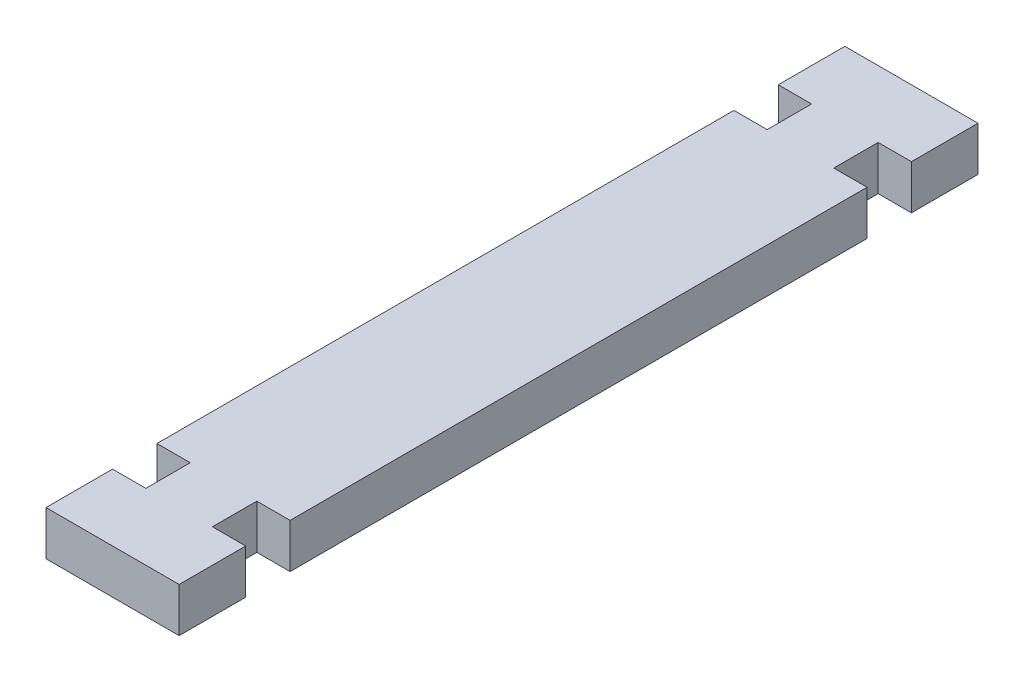
ISO-10303-21;
HEADER;
FILE_DESCRIPTION(('STEP AP214'),'2;1');
FILE_NAME('part.step','',(''),(''),'','','');
FILE_SCHEMA(('AUTOMOTIVE_DESIGN { 1 0 10303 214 1 1 1 1 }'));
ENDSEC;
DATA;
#1=APPLICATION_CONTEXT('core data for automotive mechanical design processes');
#2=APPLICATION_PROTOCOL_DEFINITION('international standard','automotive_design',2000,#1);
#3=PRODUCT_CONTEXT('',#1,'mechanical');
#4=PRODUCT('Part','Part','',(#3));
#5=PRODUCT_RELATED_PRODUCT_CATEGORY('part','',(#4));
#6=PRODUCT_DEFINITION_FORMATION('','',#4);
#7=PRODUCT_DEFINITION_CONTEXT('part definition',#1,'design');
#8=PRODUCT_DEFINITION('design','',#6,#7);
#9=PRODUCT_DEFINITION_SHAPE('','',#8);
#10=(LENGTH_UNIT() NAMED_UNIT(*) SI_UNIT(.MILLI.,.METRE.));
#11=(NAMED_UNIT(*) PLANE_ANGLE_UNIT() SI_UNIT($,.RADIAN.));
#12=(NAMED_UNIT(*) SI_UNIT($,.STERADIAN.) SOLID_ANGLE_UNIT());
#13=UNCERTAINTY_MEASURE_WITH_UNIT(LENGTH_MEASURE(1.E-05),#10,'distance_accuracy_value','');
#14=(GEOMETRIC_REPRESENTATION_CONTEXT(3) GLOBAL_UNCERTAINTY_ASSIGNED_CONTEXT((#13)) GLOBAL_UNIT_ASSIGNED_CONTEXT((#10,
#11,#12)) REPRESENTATION_CONTEXT('',''));
#15=CARTESIAN_POINT('',(0.,0.,0.));
#16=DIRECTION('',(0.,0.,1.));
#17=DIRECTION('',(1.,0.,0.));
#18=AXIS2_PLACEMENT_3D('',#15,#16,#17);
#19=CARTESIAN_POINT('',(0.,50.8,0.));
#20=DIRECTION('',(1.,0.,0.));
#21=DIRECTION('',(0.,0.,-1.));
#22=AXIS2_PLACEMENT_3D('',#19,#20,#21);
#23=PLANE('',#22);
#24=DIRECTION('',(0.,0.,1.));
#25=VECTOR('',#24,1.);
#26=CARTESIAN_POINT('',(0.,50.8,0.));
#27=LINE('',#26,#25);
#28=CARTESIAN_POINT('',(0.,50.8,-76.2));
#29=VERTEX_POINT('',#28);
#30=CARTESIAN_POINT('',(0.,50.8,0.));
#31=VERTEX_POINT('',#30);
#32=EDGE_CURVE('E278',#29,#31,#27,.T.);
#33=ORIENTED_EDGE('',*,*,#32,.F.);
#34=DIRECTION('',(0.,1.,0.));
#35=VECTOR('',#34,1.);
#36=CARTESIAN_POINT('',(0.,0.,-76.2));
#37=LINE('',#36,#35);
#38=CARTESIAN_POINT('',(0.,0.,-76.2));
#39=VERTEX_POINT('',#38);
#40=EDGE_CURVE('E185',#39,#29,#37,.T.);
#41=ORIENTED_EDGE('',*,*,#40,.F.);
#42=DIRECTION('',(0.,0.,1.));
#43=VECTOR('',#42,1.);
#44=CARTESIAN_POINT('',(0.,0.,0.));
#45=LINE('',#44,#43);
#46=CARTESIAN_POINT('',(0.,0.,0.));
#47=VERTEX_POINT('',#46);
#48=EDGE_CURVE('E259',#39,#47,#45,.T.);
#49=ORIENTED_EDGE('',*,*,#48,.T.);
#50=DIRECTION('',(0.,-1.,0.));
#51=VECTOR('',#50,1.);
#52=CARTESIAN_POINT('',(0.,50.8,0.));
#53=LINE('',#52,#51);
#54=EDGE_CURVE('E10',#31,#47,#53,.T.);
#55=ORIENTED_EDGE('',*,*,#54,.F.);
#56=EDGE_LOOP('',(#33,#41,#49,#55));
#57=FACE_BOUND('',#56,.T.);
#58=ADVANCED_FACE('F15',(#57),#23,.F.);
#59=CARTESIAN_POINT('',(152.4,50.8,0.));
#60=DIRECTION('',(-1.,0.,0.));
#61=DIRECTION('',(0.,0.,1.));
#62=AXIS2_PLACEMENT_3D('',#59,#60,#61);
#63=PLANE('',#62);
#64=DIRECTION('',(0.,0.,-1.));
#65=VECTOR('',#64,1.);
#66=CARTESIAN_POINT('',(152.4,0.,0.));
#67=LINE('',#66,#65);
#68=CARTESIAN_POINT('',(152.4,0.,0.));
#69=VERTEX_POINT('',#68);
#70=CARTESIAN_POINT('',(152.4,0.,-76.2));
#71=VERTEX_POINT('',#70);
#72=EDGE_CURVE('E272',#69,#71,#67,.T.);
#73=ORIENTED_EDGE('',*,*,#72,.T.);
#74=DIRECTION('',(0.,1.,0.));
#75=VECTOR('',#74,1.);
#76=CARTESIAN_POINT('',(152.4,0.,-76.2));
#77=LINE('',#76,#75);
#78=CARTESIAN_POINT('',(152.4,50.8,-76.2));
#79=VERTEX_POINT('',#78);
#80=EDGE_CURVE('E203',#71,#79,#77,.T.);
#81=ORIENTED_EDGE('',*,*,#80,.T.);
#82=DIRECTION('',(0.,0.,-1.));
#83=VECTOR('',#82,1.);
#84=CARTESIAN_POINT('',(152.4,50.8,0.));
#85=LINE('',#84,#83);
#86=CARTESIAN_POINT('',(152.4,50.8,0.));
#87=VERTEX_POINT('',#86);
#88=EDGE_CURVE('E285',#87,#79,#85,.T.);
#89=ORIENTED_EDGE('',*,*,#88,.F.);
#90=DIRECTION('',(0.,-1.,0.));
#91=VECTOR('',#90,1.);
#92=CARTESIAN_POINT('',(152.4,50.8,0.));
#93=LINE('',#92,#91);
#94=EDGE_CURVE('E23',#87,#69,#93,.T.);
#95=ORIENTED_EDGE('',*,*,#94,.T.);
#96=EDGE_LOOP('',(#73,#81,#89,#95));
#97=FACE_BOUND('',#96,.T.);
#98=ADVANCED_FACE('F301',(#97),#63,.F.);
#99=CARTESIAN_POINT('',(0.,0.,-787.4));
#100=VERTEX_POINT('',#99);
#101=CARTESIAN_POINT('',(0.,0.,-127.));
#102=VERTEX_POINT('',#101);
#103=EDGE_CURVE('E269',#100,#102,#45,.T.);
#104=ORIENTED_EDGE('',*,*,#103,.T.);
#105=DIRECTION('',(0.,1.,0.));
#106=VECTOR('',#105,1.);
#107=CARTESIAN_POINT('',(0.,0.,-127.));
#108=LINE('',#107,#106);
#109=CARTESIAN_POINT('',(0.,50.8,-127.));
#110=VERTEX_POINT('',#109);
#111=EDGE_CURVE('E30',#102,#110,#108,.T.);
#112=ORIENTED_EDGE('',*,*,#111,.T.);
#113=CARTESIAN_POINT('',(0.,50.8,-787.4));
#114=VERTEX_POINT('',#113);
#115=EDGE_CURVE('E173',#114,#110,#27,.T.);
#116=ORIENTED_EDGE('',*,*,#115,.F.);
#117=DIRECTION('',(0.,1.,0.));
#118=VECTOR('',#117,1.);
#119=CARTESIAN_POINT('',(0.,0.,-787.4));
#120=LINE('',#119,#118);
#121=EDGE_CURVE('E232',#100,#114,#120,.T.);
#122=ORIENTED_EDGE('',*,*,#121,.F.);
#123=EDGE_LOOP('',(#104,#112,#116,#122));
#124=FACE_BOUND('',#123,.T.);
#125=ADVANCED_FACE('F322',(#124),#23,.F.);
#126=CARTESIAN_POINT('',(152.4,50.8,-127.));
#127=VERTEX_POINT('',#126);
#128=CARTESIAN_POINT('',(152.4,50.8,-787.4));
#129=VERTEX_POINT('',#128);
#130=EDGE_CURVE('E289',#127,#129,#85,.T.);
#131=ORIENTED_EDGE('',*,*,#130,.F.);
#132=DIRECTION('',(0.,1.,0.));
#133=VECTOR('',#132,1.);
#134=CARTESIAN_POINT('',(152.4,0.,-127.));
#135=LINE('',#134,#133);
#136=CARTESIAN_POINT('',(152.4,0.,-127.));
#137=VERTEX_POINT('',#136);
#138=EDGE_CURVE('E202',#137,#127,#135,.T.);
#139=ORIENTED_EDGE('',*,*,#138,.F.);
#140=CARTESIAN_POINT('',(152.4,0.,-787.4));
#141=VERTEX_POINT('',#140);
#142=EDGE_CURVE('E276',#137,#141,#67,.T.);
#143=ORIENTED_EDGE('',*,*,#142,.T.);
#144=DIRECTION('',(0.,1.,0.));
#145=VECTOR('',#144,1.);
#146=CARTESIAN_POINT('',(152.4,0.,-787.4));
#147=LINE('',#146,#145);
#148=EDGE_CURVE('E256',#141,#129,#147,.T.);
#149=ORIENTED_EDGE('',*,*,#148,.T.);
#150=EDGE_LOOP('',(#131,#139,#143,#149));
#151=FACE_BOUND('',#150,.T.);
#152=ADVANCED_FACE('F340',(#151),#63,.F.);
#153=CARTESIAN_POINT('',(0.,0.,-914.4));
#154=VERTEX_POINT('',#153);
#155=CARTESIAN_POINT('',(0.,0.,-838.2));
#156=VERTEX_POINT('',#155);
#157=EDGE_CURVE('E265',#154,#156,#45,.T.);
#158=ORIENTED_EDGE('',*,*,#157,.T.);
#159=DIRECTION('',(0.,1.,0.));
#160=VECTOR('',#159,1.);
#161=CARTESIAN_POINT('',(0.,0.,-838.2));
#162=LINE('',#161,#160);
#163=CARTESIAN_POINT('',(0.,50.8,-838.2));
#164=VERTEX_POINT('',#163);
#165=EDGE_CURVE('E234',#156,#164,#162,.T.);
#166=ORIENTED_EDGE('',*,*,#165,.T.);
#167=CARTESIAN_POINT('',(0.,50.8,-914.4));
#168=VERTEX_POINT('',#167);
#169=EDGE_CURVE('E279',#168,#164,#27,.T.);
#170=ORIENTED_EDGE('',*,*,#169,.F.);
#171=DIRECTION('',(0.,-1.,0.));
#172=VECTOR('',#171,1.);
#173=CARTESIAN_POINT('',(0.,50.8,-914.4));
#174=LINE('',#173,#172);
#175=EDGE_CURVE('E291',#168,#154,#174,.T.);
#176=ORIENTED_EDGE('',*,*,#175,.T.);
#177=EDGE_LOOP('',(#158,#166,#170,#176));
#178=FACE_BOUND('',#177,.T.);
#179=ADVANCED_FACE('F17',(#178),#23,.F.);
#180=CARTESIAN_POINT('',(0.,50.8,0.));
#181=DIRECTION('',(0.,0.,-1.));
#182=DIRECTION('',(-1.,0.,0.));
#183=AXIS2_PLACEMENT_3D('',#180,#181,#182);
#184=PLANE('',#183);
#185=DIRECTION('',(1.,0.,0.));
#186=VECTOR('',#185,1.);
#187=CARTESIAN_POINT('',(0.,0.,0.));
#188=LINE('',#187,#186);
#189=EDGE_CURVE('E268',#47,#69,#188,.T.);
#190=ORIENTED_EDGE('',*,*,#189,.T.);
#191=ORIENTED_EDGE('',*,*,#94,.F.);
#192=DIRECTION('',(1.,0.,0.));
#193=VECTOR('',#192,1.);
#194=CARTESIAN_POINT('',(0.,50.8,0.));
#195=LINE('',#194,#193);
#196=EDGE_CURVE('E282',#31,#87,#195,.T.);
#197=ORIENTED_EDGE('',*,*,#196,.F.);
#198=ORIENTED_EDGE('',*,*,#54,.T.);
#199=EDGE_LOOP('',(#190,#191,#197,#198));
#200=FACE_BOUND('',#199,.T.);
#201=ADVANCED_FACE('F315',(#200),#184,.F.);
#202=CARTESIAN_POINT('',(152.4,50.8,-838.2));
#203=VERTEX_POINT('',#202);
#204=CARTESIAN_POINT('',(152.4,50.8,-914.4));
#205=VERTEX_POINT('',#204);
#206=EDGE_CURVE('E284',#203,#205,#85,.T.);
#207=ORIENTED_EDGE('',*,*,#206,.F.);
#208=DIRECTION('',(0.,1.,0.));
#209=VECTOR('',#208,1.);
#210=CARTESIAN_POINT('',(152.4,0.,-838.2));
#211=LINE('',#210,#209);
#212=CARTESIAN_POINT('',(152.4,0.,-838.2));
#213=VERTEX_POINT('',#212);
#214=EDGE_CURVE('E255',#213,#203,#211,.T.);
#215=ORIENTED_EDGE('',*,*,#214,.F.);
#216=CARTESIAN_POINT('',(152.4,0.,-914.4));
#217=VERTEX_POINT('',#216);
#218=EDGE_CURVE('E271',#213,#217,#67,.T.);
#219=ORIENTED_EDGE('',*,*,#218,.T.);
#220=DIRECTION('',(0.,-1.,0.));
#221=VECTOR('',#220,1.);
#222=CARTESIAN_POINT('',(152.4,50.8,-914.4));
#223=LINE('',#222,#221);
#224=EDGE_CURVE('E294',#205,#217,#223,.T.);
#225=ORIENTED_EDGE('',*,*,#224,.F.);
#226=EDGE_LOOP('',(#207,#215,#219,#225));
#227=FACE_BOUND('',#226,.T.);
#228=ADVANCED_FACE('F341',(#227),#63,.F.);
#229=CARTESIAN_POINT('',(0.,50.8,-914.4));
#230=DIRECTION('',(0.,0.,1.));
#231=DIRECTION('',(1.,0.,0.));
#232=AXIS2_PLACEMENT_3D('',#229,#230,#231);
#233=PLANE('',#232);
#234=DIRECTION('',(-1.,0.,0.));
#235=VECTOR('',#234,1.);
#236=CARTESIAN_POINT('',(0.,0.,-914.4));
#237=LINE('',#236,#235);
#238=EDGE_CURVE('E275',#217,#154,#237,.T.);
#239=ORIENTED_EDGE('',*,*,#238,.T.);
#240=ORIENTED_EDGE('',*,*,#175,.F.);
#241=DIRECTION('',(-1.,0.,0.));
#242=VECTOR('',#241,1.);
#243=CARTESIAN_POINT('',(0.,50.8,-914.4));
#244=LINE('',#243,#242);
#245=EDGE_CURVE('E288',#205,#168,#244,.T.);
#246=ORIENTED_EDGE('',*,*,#245,.F.);
#247=ORIENTED_EDGE('',*,*,#224,.T.);
#248=EDGE_LOOP('',(#239,#240,#246,#247));
#249=FACE_BOUND('',#248,.T.);
#250=ADVANCED_FACE('F366',(#249),#233,.F.);
#251=CARTESIAN_POINT('',(0.,50.8,-914.4));
#252=DIRECTION('',(0.,-1.,0.));
#253=DIRECTION('',(0.,0.,-1.));
#254=AXIS2_PLACEMENT_3D('',#251,#252,#253);
#255=PLANE('',#254);
#256=DIRECTION('',(0.,0.,-1.));
#257=VECTOR('',#256,1.);
#258=CARTESIAN_POINT('',(38.1,50.8,-127.));
#259=LINE('',#258,#257);
#260=CARTESIAN_POINT('',(38.1,50.8,-76.2));
#261=VERTEX_POINT('',#260);
#262=CARTESIAN_POINT('',(38.1,50.8,-127.));
#263=VERTEX_POINT('',#262);
#264=EDGE_CURVE('E162',#261,#263,#259,.T.);
#265=ORIENTED_EDGE('',*,*,#264,.F.);
#266=DIRECTION('',(1.,0.,0.));
#267=VECTOR('',#266,1.);
#268=CARTESIAN_POINT('',(38.1,50.8,-76.2));
#269=LINE('',#268,#267);
#270=EDGE_CURVE('E174',#29,#261,#269,.T.);
#271=ORIENTED_EDGE('',*,*,#270,.F.);
#272=ORIENTED_EDGE('',*,*,#32,.T.);
#273=ORIENTED_EDGE('',*,*,#196,.T.);
#274=ORIENTED_EDGE('',*,*,#88,.T.);
#275=DIRECTION('',(1.,0.,0.));
#276=VECTOR('',#275,1.);
#277=CARTESIAN_POINT('',(152.4,50.8,-76.2));
#278=LINE('',#277,#276);
#279=CARTESIAN_POINT('',(114.3,50.8,-76.2));
#280=VERTEX_POINT('',#279);
#281=EDGE_CURVE('E193',#280,#79,#278,.T.);
#282=ORIENTED_EDGE('',*,*,#281,.F.);
#283=DIRECTION('',(0.,0.,1.));
#284=VECTOR('',#283,1.);
#285=CARTESIAN_POINT('',(114.3,50.8,-127.));
#286=LINE('',#285,#284);
#287=CARTESIAN_POINT('',(114.3,50.8,-127.));
#288=VERTEX_POINT('',#287);
#289=EDGE_CURVE('E190',#288,#280,#286,.T.);
#290=ORIENTED_EDGE('',*,*,#289,.F.);
#291=DIRECTION('',(-1.,0.,0.));
#292=VECTOR('',#291,1.);
#293=CARTESIAN_POINT('',(152.4,50.8,-127.));
#294=LINE('',#293,#292);
#295=EDGE_CURVE('E184',#127,#288,#294,.T.);
#296=ORIENTED_EDGE('',*,*,#295,.F.);
#297=ORIENTED_EDGE('',*,*,#130,.T.);
#298=DIRECTION('',(1.,0.,0.));
#299=VECTOR('',#298,1.);
#300=CARTESIAN_POINT('',(152.4,50.8,-787.4));
#301=LINE('',#300,#299);
#302=CARTESIAN_POINT('',(114.3,50.8,-787.4));
#303=VERTEX_POINT('',#302);
#304=EDGE_CURVE('E243',#303,#129,#301,.T.);
#305=ORIENTED_EDGE('',*,*,#304,.F.);
#306=DIRECTION('',(0.,0.,1.));
#307=VECTOR('',#306,1.);
#308=CARTESIAN_POINT('',(114.3,50.8,-838.2));
#309=LINE('',#308,#307);
#310=CARTESIAN_POINT('',(114.3,50.8,-838.2));
#311=VERTEX_POINT('',#310);
#312=EDGE_CURVE('E240',#311,#303,#309,.T.);
#313=ORIENTED_EDGE('',*,*,#312,.F.);
#314=DIRECTION('',(-1.,0.,0.));
#315=VECTOR('',#314,1.);
#316=CARTESIAN_POINT('',(152.4,50.8,-838.2));
#317=LINE('',#316,#315);
#318=EDGE_CURVE('E231',#203,#311,#317,.T.);
#319=ORIENTED_EDGE('',*,*,#318,.F.);
#320=ORIENTED_EDGE('',*,*,#206,.T.);
#321=ORIENTED_EDGE('',*,*,#245,.T.);
#322=ORIENTED_EDGE('',*,*,#169,.T.);
#323=DIRECTION('',(-1.,0.,0.));
#324=VECTOR('',#323,1.);
#325=CARTESIAN_POINT('',(38.1,50.8,-838.2));
#326=LINE('',#325,#324);
#327=CARTESIAN_POINT('',(38.1,50.8,-838.2));
#328=VERTEX_POINT('',#327);
#329=EDGE_CURVE('E214',#328,#164,#326,.T.);
#330=ORIENTED_EDGE('',*,*,#329,.F.);
#331=DIRECTION('',(0.,0.,-1.));
#332=VECTOR('',#331,1.);
#333=CARTESIAN_POINT('',(38.1,50.8,-838.2));
#334=LINE('',#333,#332);
#335=CARTESIAN_POINT('',(38.1,50.8,-787.4));
#336=VERTEX_POINT('',#335);
#337=EDGE_CURVE('E206',#336,#328,#334,.T.);
#338=ORIENTED_EDGE('',*,*,#337,.F.);
#339=DIRECTION('',(1.,0.,0.));
#340=VECTOR('',#339,1.);
#341=CARTESIAN_POINT('',(38.1,50.8,-787.4));
#342=LINE('',#341,#340);
#343=EDGE_CURVE('E216',#114,#336,#342,.T.);
#344=ORIENTED_EDGE('',*,*,#343,.F.);
#345=ORIENTED_EDGE('',*,*,#115,.T.);
#346=DIRECTION('',(-1.,0.,0.));
#347=VECTOR('',#346,1.);
#348=CARTESIAN_POINT('',(38.1,50.8,-127.));
#349=LINE('',#348,#347);
#350=EDGE_CURVE('E154',#263,#110,#349,.T.);
#351=ORIENTED_EDGE('',*,*,#350,.F.);
#352=EDGE_LOOP('',(#265,#271,#272,#273,#274,#282,#290,#296,#297,#305,#313,#319,#320,#321,#322,
#330,#338,#344,#345,#351));
#353=FACE_BOUND('',#352,.T.);
#354=ADVANCED_FACE('F170',(#353),#255,.F.);
#355=CARTESIAN_POINT('',(0.,0.,-914.4));
#356=DIRECTION('',(0.,-1.,0.));
#357=DIRECTION('',(0.,0.,-1.));
#358=AXIS2_PLACEMENT_3D('',#355,#356,#357);
#359=PLANE('',#358);
#360=DIRECTION('',(1.,0.,0.));
#361=VECTOR('',#360,1.);
#362=CARTESIAN_POINT('',(38.1,0.,-76.2));
#363=LINE('',#362,#361);
#364=CARTESIAN_POINT('',(38.1,0.,-76.2));
#365=VERTEX_POINT('',#364);
#366=EDGE_CURVE('E159',#39,#365,#363,.T.);
#367=ORIENTED_EDGE('',*,*,#366,.T.);
#368=DIRECTION('',(0.,0.,-1.));
#369=VECTOR('',#368,1.);
#370=CARTESIAN_POINT('',(38.1,0.,-127.));
#371=LINE('',#370,#369);
#372=CARTESIAN_POINT('',(38.1,0.,-127.));
#373=VERTEX_POINT('',#372);
#374=EDGE_CURVE('E176',#365,#373,#371,.T.);
#375=ORIENTED_EDGE('',*,*,#374,.T.);
#376=DIRECTION('',(-1.,0.,0.));
#377=VECTOR('',#376,1.);
#378=CARTESIAN_POINT('',(38.1,0.,-127.));
#379=LINE('',#378,#377);
#380=EDGE_CURVE('E155',#373,#102,#379,.T.);
#381=ORIENTED_EDGE('',*,*,#380,.T.);
#382=ORIENTED_EDGE('',*,*,#103,.F.);
#383=DIRECTION('',(1.,0.,0.));
#384=VECTOR('',#383,1.);
#385=CARTESIAN_POINT('',(38.1,0.,-787.4));
#386=LINE('',#385,#384);
#387=CARTESIAN_POINT('',(38.1,0.,-787.4));
#388=VERTEX_POINT('',#387);
#389=EDGE_CURVE('E225',#100,#388,#386,.T.);
#390=ORIENTED_EDGE('',*,*,#389,.T.);
#391=DIRECTION('',(0.,0.,-1.));
#392=VECTOR('',#391,1.);
#393=CARTESIAN_POINT('',(38.1,0.,-838.2));
#394=LINE('',#393,#392);
#395=CARTESIAN_POINT('',(38.1,0.,-838.2));
#396=VERTEX_POINT('',#395);
#397=EDGE_CURVE('E219',#388,#396,#394,.T.);
#398=ORIENTED_EDGE('',*,*,#397,.T.);
#399=DIRECTION('',(-1.,0.,0.));
#400=VECTOR('',#399,1.);
#401=CARTESIAN_POINT('',(38.1,0.,-838.2));
#402=LINE('',#401,#400);
#403=EDGE_CURVE('E222',#396,#156,#402,.T.);
#404=ORIENTED_EDGE('',*,*,#403,.T.);
#405=ORIENTED_EDGE('',*,*,#157,.F.);
#406=ORIENTED_EDGE('',*,*,#238,.F.);
#407=ORIENTED_EDGE('',*,*,#218,.F.);
#408=DIRECTION('',(-1.,0.,0.));
#409=VECTOR('',#408,1.);
#410=CARTESIAN_POINT('',(152.4,0.,-838.2));
#411=LINE('',#410,#409);
#412=CARTESIAN_POINT('',(114.3,0.,-838.2));
#413=VERTEX_POINT('',#412);
#414=EDGE_CURVE('E246',#213,#413,#411,.T.);
#415=ORIENTED_EDGE('',*,*,#414,.T.);
#416=DIRECTION('',(0.,0.,1.));
#417=VECTOR('',#416,1.);
#418=CARTESIAN_POINT('',(114.3,0.,-838.2));
#419=LINE('',#418,#417);
#420=CARTESIAN_POINT('',(114.3,0.,-787.4));
#421=VERTEX_POINT('',#420);
#422=EDGE_CURVE('E249',#413,#421,#419,.T.);
#423=ORIENTED_EDGE('',*,*,#422,.T.);
#424=DIRECTION('',(1.,0.,0.));
#425=VECTOR('',#424,1.);
#426=CARTESIAN_POINT('',(152.4,0.,-787.4));
#427=LINE('',#426,#425);
#428=EDGE_CURVE('E252',#421,#141,#427,.T.);
#429=ORIENTED_EDGE('',*,*,#428,.T.);
#430=ORIENTED_EDGE('',*,*,#142,.F.);
#431=DIRECTION('',(-1.,0.,0.));
#432=VECTOR('',#431,1.);
#433=CARTESIAN_POINT('',(152.4,0.,-127.));
#434=LINE('',#433,#432);
#435=CARTESIAN_POINT('',(114.3,0.,-127.));
#436=VERTEX_POINT('',#435);
#437=EDGE_CURVE('E195',#137,#436,#434,.T.);
#438=ORIENTED_EDGE('',*,*,#437,.T.);
#439=DIRECTION('',(0.,0.,1.));
#440=VECTOR('',#439,1.);
#441=CARTESIAN_POINT('',(114.3,0.,-127.));
#442=LINE('',#441,#440);
#443=CARTESIAN_POINT('',(114.3,0.,-76.2));
#444=VERTEX_POINT('',#443);
#445=EDGE_CURVE('E38',#436,#444,#442,.T.);
#446=ORIENTED_EDGE('',*,*,#445,.T.);
#447=DIRECTION('',(1.,0.,0.));
#448=VECTOR('',#447,1.);
#449=CARTESIAN_POINT('',(152.4,0.,-76.2));
#450=LINE('',#449,#448);
#451=EDGE_CURVE('E199',#444,#71,#450,.T.);
#452=ORIENTED_EDGE('',*,*,#451,.T.);
#453=ORIENTED_EDGE('',*,*,#72,.F.);
#454=ORIENTED_EDGE('',*,*,#189,.F.);
#455=ORIENTED_EDGE('',*,*,#48,.F.);
#456=EDGE_LOOP('',(#367,#375,#381,#382,#390,#398,#404,#405,#406,#407,#415,#423,#429,#430,#438,
#446,#452,#453,#454,#455));
#457=FACE_BOUND('',#456,.T.);
#458=ADVANCED_FACE('F306',(#457),#359,.T.);
#459=CARTESIAN_POINT('',(152.4,0.,-787.4));
#460=DIRECTION('',(0.,0.,1.));
#461=DIRECTION('',(1.,0.,0.));
#462=AXIS2_PLACEMENT_3D('',#459,#460,#461);
#463=PLANE('',#462);
#464=ORIENTED_EDGE('',*,*,#304,.T.);
#465=ORIENTED_EDGE('',*,*,#148,.F.);
#466=ORIENTED_EDGE('',*,*,#428,.F.);
#467=DIRECTION('',(0.,1.,0.));
#468=VECTOR('',#467,1.);
#469=CARTESIAN_POINT('',(114.3,0.,-787.4));
#470=LINE('',#469,#468);
#471=EDGE_CURVE('E260',#421,#303,#470,.T.);
#472=ORIENTED_EDGE('',*,*,#471,.T.);
#473=EDGE_LOOP('',(#464,#465,#466,#472));
#474=FACE_BOUND('',#473,.T.);
#475=ADVANCED_FACE('F375',(#474),#463,.F.);
#476=CARTESIAN_POINT('',(114.3,0.,-838.2));
#477=DIRECTION('',(-1.,0.,0.));
#478=DIRECTION('',(0.,0.,1.));
#479=AXIS2_PLACEMENT_3D('',#476,#477,#478);
#480=PLANE('',#479);
#481=ORIENTED_EDGE('',*,*,#312,.T.);
#482=ORIENTED_EDGE('',*,*,#471,.F.);
#483=ORIENTED_EDGE('',*,*,#422,.F.);
#484=DIRECTION('',(0.,1.,0.));
#485=VECTOR('',#484,1.);
#486=CARTESIAN_POINT('',(114.3,0.,-838.2));
#487=LINE('',#486,#485);
#488=EDGE_CURVE('E262',#413,#311,#487,.T.);
#489=ORIENTED_EDGE('',*,*,#488,.T.);
#490=EDGE_LOOP('',(#481,#482,#483,#489));
#491=FACE_BOUND('',#490,.T.);
#492=ADVANCED_FACE('F379',(#491),#480,.F.);
#493=CARTESIAN_POINT('',(152.4,0.,-838.2));
#494=DIRECTION('',(0.,0.,-1.));
#495=DIRECTION('',(-1.,0.,0.));
#496=AXIS2_PLACEMENT_3D('',#493,#494,#495);
#497=PLANE('',#496);
#498=ORIENTED_EDGE('',*,*,#318,.T.);
#499=ORIENTED_EDGE('',*,*,#488,.F.);
#500=ORIENTED_EDGE('',*,*,#414,.F.);
#501=ORIENTED_EDGE('',*,*,#214,.T.);
#502=EDGE_LOOP('',(#498,#499,#500,#501));
#503=FACE_BOUND('',#502,.T.);
#504=ADVANCED_FACE('F381',(#503),#497,.F.);
#505=CARTESIAN_POINT('',(38.1,0.,-838.2));
#506=DIRECTION('',(1.,0.,0.));
#507=DIRECTION('',(0.,0.,-1.));
#508=AXIS2_PLACEMENT_3D('',#505,#506,#507);
#509=PLANE('',#508);
#510=ORIENTED_EDGE('',*,*,#337,.T.);
#511=DIRECTION('',(0.,1.,0.));
#512=VECTOR('',#511,1.);
#513=CARTESIAN_POINT('',(38.1,0.,-838.2));
#514=LINE('',#513,#512);
#515=EDGE_CURVE('E228',#396,#328,#514,.T.);
#516=ORIENTED_EDGE('',*,*,#515,.F.);
#517=ORIENTED_EDGE('',*,*,#397,.F.);
#518=DIRECTION('',(0.,1.,0.));
#519=VECTOR('',#518,1.);
#520=CARTESIAN_POINT('',(38.1,0.,-787.4));
#521=LINE('',#520,#519);
#522=EDGE_CURVE('E229',#388,#336,#521,.T.);
#523=ORIENTED_EDGE('',*,*,#522,.T.);
#524=EDGE_LOOP('',(#510,#516,#517,#523));
#525=FACE_BOUND('',#524,.T.);
#526=ADVANCED_FACE('F398',(#525),#509,.F.);
#527=CARTESIAN_POINT('',(38.1,0.,-787.4));
#528=DIRECTION('',(0.,0.,1.));
#529=DIRECTION('',(1.,0.,0.));
#530=AXIS2_PLACEMENT_3D('',#527,#528,#529);
#531=PLANE('',#530);
#532=ORIENTED_EDGE('',*,*,#343,.T.);
#533=ORIENTED_EDGE('',*,*,#522,.F.);
#534=ORIENTED_EDGE('',*,*,#389,.F.);
#535=ORIENTED_EDGE('',*,*,#121,.T.);
#536=EDGE_LOOP('',(#532,#533,#534,#535));
#537=FACE_BOUND('',#536,.T.);
#538=ADVANCED_FACE('F395',(#537),#531,.F.);
#539=CARTESIAN_POINT('',(38.1,0.,-838.2));
#540=DIRECTION('',(0.,0.,-1.));
#541=DIRECTION('',(-1.,0.,0.));
#542=AXIS2_PLACEMENT_3D('',#539,#540,#541);
#543=PLANE('',#542);
#544=ORIENTED_EDGE('',*,*,#329,.T.);
#545=ORIENTED_EDGE('',*,*,#165,.F.);
#546=ORIENTED_EDGE('',*,*,#403,.F.);
#547=ORIENTED_EDGE('',*,*,#515,.T.);
#548=EDGE_LOOP('',(#544,#545,#546,#547));
#549=FACE_BOUND('',#548,.T.);
#550=ADVANCED_FACE('F358',(#549),#543,.F.);
#551=CARTESIAN_POINT('',(152.4,0.,-76.2));
#552=DIRECTION('',(0.,0.,1.));
#553=DIRECTION('',(1.,0.,0.));
#554=AXIS2_PLACEMENT_3D('',#551,#552,#553);
#555=PLANE('',#554);
#556=ORIENTED_EDGE('',*,*,#281,.T.);
#557=ORIENTED_EDGE('',*,*,#80,.F.);
#558=ORIENTED_EDGE('',*,*,#451,.F.);
#559=DIRECTION('',(0.,1.,0.));
#560=VECTOR('',#559,1.);
#561=CARTESIAN_POINT('',(114.3,0.,-76.2));
#562=LINE('',#561,#560);
#563=EDGE_CURVE('E207',#444,#280,#562,.T.);
#564=ORIENTED_EDGE('',*,*,#563,.T.);
#565=EDGE_LOOP('',(#556,#557,#558,#564));
#566=FACE_BOUND('',#565,.T.);
#567=ADVANCED_FACE('F310',(#566),#555,.F.);
#568=CARTESIAN_POINT('',(114.3,0.,-127.));
#569=DIRECTION('',(-1.,0.,0.));
#570=DIRECTION('',(0.,0.,1.));
#571=AXIS2_PLACEMENT_3D('',#568,#569,#570);
#572=PLANE('',#571);
#573=ORIENTED_EDGE('',*,*,#289,.T.);
#574=ORIENTED_EDGE('',*,*,#563,.F.);
#575=ORIENTED_EDGE('',*,*,#445,.F.);
#576=DIRECTION('',(0.,1.,0.));
#577=VECTOR('',#576,1.);
#578=CARTESIAN_POINT('',(114.3,0.,-127.));
#579=LINE('',#578,#577);
#580=EDGE_CURVE('E209',#436,#288,#579,.T.);
#581=ORIENTED_EDGE('',*,*,#580,.T.);
#582=EDGE_LOOP('',(#573,#574,#575,#581));
#583=FACE_BOUND('',#582,.T.);
#584=ADVANCED_FACE('F385',(#583),#572,.F.);
#585=CARTESIAN_POINT('',(152.4,0.,-127.));
#586=DIRECTION('',(0.,0.,-1.));
#587=DIRECTION('',(-1.,0.,0.));
#588=AXIS2_PLACEMENT_3D('',#585,#586,#587);
#589=PLANE('',#588);
#590=ORIENTED_EDGE('',*,*,#295,.T.);
#591=ORIENTED_EDGE('',*,*,#580,.F.);
#592=ORIENTED_EDGE('',*,*,#437,.F.);
#593=ORIENTED_EDGE('',*,*,#138,.T.);
#594=EDGE_LOOP('',(#590,#591,#592,#593));
#595=FACE_BOUND('',#594,.T.);
#596=ADVANCED_FACE('F333',(#595),#589,.F.);
#597=CARTESIAN_POINT('',(38.1,0.,-127.));
#598=DIRECTION('',(1.,0.,0.));
#599=DIRECTION('',(0.,0.,-1.));
#600=AXIS2_PLACEMENT_3D('',#597,#598,#599);
#601=PLANE('',#600);
#602=ORIENTED_EDGE('',*,*,#264,.T.);
#603=DIRECTION('',(0.,1.,0.));
#604=VECTOR('',#603,1.);
#605=CARTESIAN_POINT('',(38.1,0.,-127.));
#606=LINE('',#605,#604);
#607=EDGE_CURVE('E150',#373,#263,#606,.T.);
#608=ORIENTED_EDGE('',*,*,#607,.F.);
#609=ORIENTED_EDGE('',*,*,#374,.F.);
#610=DIRECTION('',(0.,1.,0.));
#611=VECTOR('',#610,1.);
#612=CARTESIAN_POINT('',(38.1,0.,-76.2));
#613=LINE('',#612,#611);
#614=EDGE_CURVE('E164',#365,#261,#613,.T.);
#615=ORIENTED_EDGE('',*,*,#614,.T.);
#616=EDGE_LOOP('',(#602,#608,#609,#615));
#617=FACE_BOUND('',#616,.T.);
#618=ADVANCED_FACE('F163',(#617),#601,.F.);
#619=CARTESIAN_POINT('',(38.1,0.,-76.2));
#620=DIRECTION('',(0.,0.,1.));
#621=DIRECTION('',(1.,0.,0.));
#622=AXIS2_PLACEMENT_3D('',#619,#620,#621);
#623=PLANE('',#622);
#624=ORIENTED_EDGE('',*,*,#270,.T.);
#625=ORIENTED_EDGE('',*,*,#614,.F.);
#626=ORIENTED_EDGE('',*,*,#366,.F.);
#627=ORIENTED_EDGE('',*,*,#40,.T.);
#628=EDGE_LOOP('',(#624,#625,#626,#627));
#629=FACE_BOUND('',#628,.T.);
#630=ADVANCED_FACE('F324',(#629),#623,.F.);
#631=CARTESIAN_POINT('',(38.1,0.,-127.));
#632=DIRECTION('',(0.,0.,-1.));
#633=DIRECTION('',(-1.,0.,0.));
#634=AXIS2_PLACEMENT_3D('',#631,#632,#633);
#635=PLANE('',#634);
#636=ORIENTED_EDGE('',*,*,#350,.T.);
#637=ORIENTED_EDGE('',*,*,#111,.F.);
#638=ORIENTED_EDGE('',*,*,#380,.F.);
#639=ORIENTED_EDGE('',*,*,#607,.T.);
#640=EDGE_LOOP('',(#636,#637,#638,#639));
#641=FACE_BOUND('',#640,.T.);
#642=ADVANCED_FACE('F152',(#641),#635,.F.);
#643=CLOSED_SHELL('',(#58,#98,#125,#152,#179,#201,#228,#250,#354,#458,#475,#492,#504,#526,#538,
#550,#567,#584,#596,#618,#630,#642));
#644=MANIFOLD_SOLID_BREP('B1',#643);
#645=ADVANCED_BREP_SHAPE_REPRESENTATION('',(#18,#644),#14);
#646=SHAPE_DEFINITION_REPRESENTATION(#9,#645);
ENDSEC;
END-ISO-10303-21;
